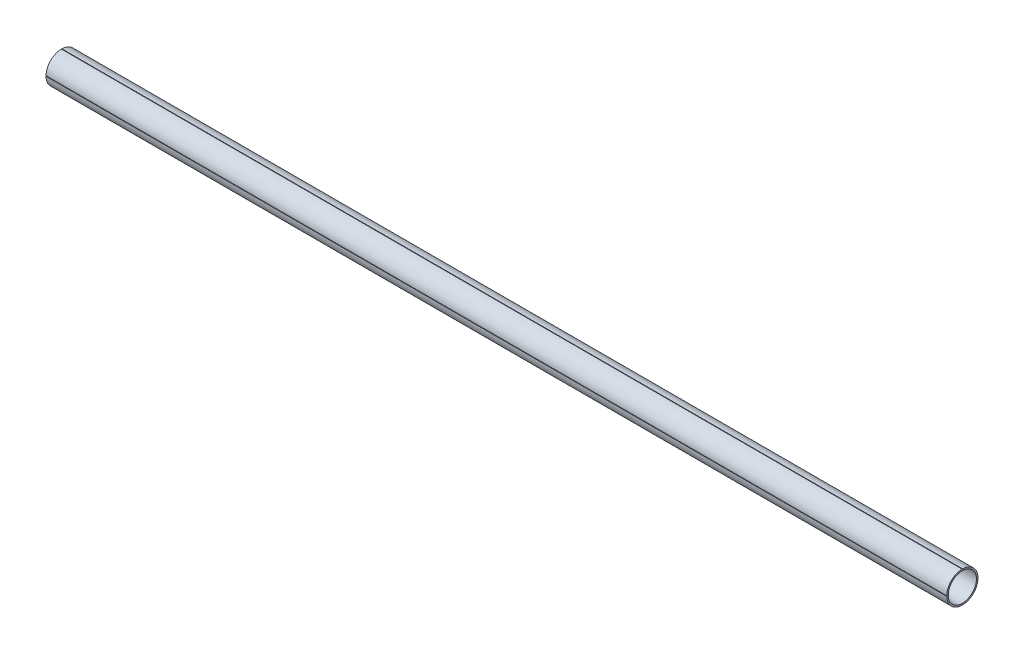
ISO-10303-21;
HEADER;
FILE_DESCRIPTION(('STEP AP214'),'2;1');
FILE_NAME('part.step','',(''),(''),'','','');
FILE_SCHEMA(('AUTOMOTIVE_DESIGN { 1 0 10303 214 1 1 1 1 }'));
ENDSEC;
DATA;
#1=APPLICATION_CONTEXT('core data for automotive mechanical design processes');
#2=APPLICATION_PROTOCOL_DEFINITION('international standard','automotive_design',2000,#1);
#3=PRODUCT_CONTEXT('',#1,'mechanical');
#4=PRODUCT('Part','Part','',(#3));
#5=PRODUCT_RELATED_PRODUCT_CATEGORY('part','',(#4));
#6=PRODUCT_DEFINITION_FORMATION('','',#4);
#7=PRODUCT_DEFINITION_CONTEXT('part definition',#1,'design');
#8=PRODUCT_DEFINITION('design','',#6,#7);
#9=PRODUCT_DEFINITION_SHAPE('','',#8);
#10=(LENGTH_UNIT() NAMED_UNIT(*) SI_UNIT(.MILLI.,.METRE.));
#11=(NAMED_UNIT(*) PLANE_ANGLE_UNIT() SI_UNIT($,.RADIAN.));
#12=(NAMED_UNIT(*) SI_UNIT($,.STERADIAN.) SOLID_ANGLE_UNIT());
#13=UNCERTAINTY_MEASURE_WITH_UNIT(LENGTH_MEASURE(1.E-05),#10,'distance_accuracy_value','');
#14=(GEOMETRIC_REPRESENTATION_CONTEXT(3) GLOBAL_UNCERTAINTY_ASSIGNED_CONTEXT((#13)) GLOBAL_UNIT_ASSIGNED_CONTEXT((#10,
#11,#12)) REPRESENTATION_CONTEXT('',''));
#15=CARTESIAN_POINT('',(0.,0.,0.));
#16=DIRECTION('',(0.,0.,1.));
#17=DIRECTION('',(1.,0.,0.));
#18=AXIS2_PLACEMENT_3D('',#15,#16,#17);
#19=CARTESIAN_POINT('',(-457.2,0.,0.));
#20=DIRECTION('',(1.,0.,0.));
#21=DIRECTION('',(0.,0.,-1.));
#22=AXIS2_PLACEMENT_3D('',#19,#20,#21);
#23=CYLINDRICAL_SURFACE('',#22,15.875);
#24=CARTESIAN_POINT('',(457.2,0.,0.));
#25=DIRECTION('',(1.,0.,0.));
#26=DIRECTION('',(0.,0.,-1.));
#27=AXIS2_PLACEMENT_3D('',#24,#25,#26);
#28=CIRCLE('',#27,15.875);
#29=CARTESIAN_POINT('',(457.2,-0.249999999999835,15.8730313740004));
#30=VERTEX_POINT('',#29);
#31=CARTESIAN_POINT('',(457.2,-15.8730313740004,0.249999999999999));
#32=VERTEX_POINT('',#31);
#33=EDGE_CURVE('E160',#30,#32,#28,.T.);
#34=ORIENTED_EDGE('',*,*,#33,.F.);
#35=DIRECTION('',(1.,0.,0.));
#36=VECTOR('',#35,1.);
#37=CARTESIAN_POINT('',(-457.2,-0.249999999999835,15.8730313740004));
#38=LINE('',#37,#36);
#39=CARTESIAN_POINT('',(-457.2,-0.249999999999835,15.8730313740004));
#40=VERTEX_POINT('',#39);
#41=EDGE_CURVE('E11',#40,#30,#38,.T.);
#42=ORIENTED_EDGE('',*,*,#41,.F.);
#43=CARTESIAN_POINT('',(-457.2,0.,0.));
#44=DIRECTION('',(1.,0.,0.));
#45=DIRECTION('',(0.,0.,-1.));
#46=AXIS2_PLACEMENT_3D('',#43,#44,#45);
#47=CIRCLE('',#46,15.875);
#48=CARTESIAN_POINT('',(-457.2,-15.8730313740004,0.249999999999999));
#49=VERTEX_POINT('',#48);
#50=EDGE_CURVE('E193',#40,#49,#47,.T.);
#51=ORIENTED_EDGE('',*,*,#50,.T.);
#52=DIRECTION('',(1.,0.,0.));
#53=VECTOR('',#52,1.);
#54=CARTESIAN_POINT('',(-457.2,-15.8730313740004,0.249999999999999));
#55=LINE('',#54,#53);
#56=EDGE_CURVE('E40',#49,#32,#55,.T.);
#57=ORIENTED_EDGE('',*,*,#56,.T.);
#58=EDGE_LOOP('',(#34,#42,#51,#57));
#59=FACE_BOUND('',#58,.T.);
#60=ADVANCED_FACE('F37',(#59),#23,.T.);
#61=CARTESIAN_POINT('',(-457.2,1.63166570611758E-13,15.575));
#62=DIRECTION('',(0.,0.766143187719861,0.642669912093643));
#63=DIRECTION('',(0.,-0.642669912093643,0.766143187719861));
#64=AXIS2_PLACEMENT_3D('',#61,#62,#63);
#65=PLANE('',#64);
#66=DIRECTION('',(0.,-0.642669912093643,0.76614318771986));
#67=VECTOR('',#66,1.);
#68=CARTESIAN_POINT('',(457.2,1.63166570611758E-13,15.575));
#69=LINE('',#68,#67);
#70=CARTESIAN_POINT('',(457.2,1.63166570611758E-13,15.575));
#71=VERTEX_POINT('',#70);
#72=EDGE_CURVE('E191',#71,#30,#69,.T.);
#73=ORIENTED_EDGE('',*,*,#72,.F.);
#74=DIRECTION('',(1.,0.,0.));
#75=VECTOR('',#74,1.);
#76=CARTESIAN_POINT('',(-457.2,1.63166570611758E-13,15.575));
#77=LINE('',#76,#75);
#78=CARTESIAN_POINT('',(-457.2,1.63166570611758E-13,15.575));
#79=VERTEX_POINT('',#78);
#80=EDGE_CURVE('E47',#79,#71,#77,.T.);
#81=ORIENTED_EDGE('',*,*,#80,.F.);
#82=DIRECTION('',(0.,-0.642669912093643,0.76614318771986));
#83=VECTOR('',#82,1.);
#84=CARTESIAN_POINT('',(-457.2,1.63166570611758E-13,15.575));
#85=LINE('',#84,#83);
#86=EDGE_CURVE('E150',#79,#40,#85,.T.);
#87=ORIENTED_EDGE('',*,*,#86,.T.);
#88=ORIENTED_EDGE('',*,*,#41,.T.);
#89=EDGE_LOOP('',(#73,#81,#87,#88));
#90=FACE_BOUND('',#89,.T.);
#91=ADVANCED_FACE('F221',(#90),#65,.T.);
#92=CARTESIAN_POINT('',(-457.2,0.250000000000165,15.8730313740004));
#93=DIRECTION('',(0.,-0.766143187719853,0.642669912093652));
#94=DIRECTION('',(0.,-0.642669912093652,-0.766143187719853));
#95=AXIS2_PLACEMENT_3D('',#92,#93,#94);
#96=PLANE('',#95);
#97=DIRECTION('',(0.,-0.642669912093652,-0.766143187719852));
#98=VECTOR('',#97,1.);
#99=CARTESIAN_POINT('',(457.2,0.250000000000165,15.8730313740004));
#100=LINE('',#99,#98);
#101=CARTESIAN_POINT('',(457.2,0.250000000000163,15.8730313740004));
#102=VERTEX_POINT('',#101);
#103=EDGE_CURVE('E136',#102,#71,#100,.T.);
#104=ORIENTED_EDGE('',*,*,#103,.F.);
#105=DIRECTION('',(1.,0.,0.));
#106=VECTOR('',#105,1.);
#107=CARTESIAN_POINT('',(-457.2,0.250000000000163,15.8730313740004));
#108=LINE('',#107,#106);
#109=CARTESIAN_POINT('',(-457.2,0.250000000000163,15.8730313740004));
#110=VERTEX_POINT('',#109);
#111=EDGE_CURVE('E131',#110,#102,#108,.T.);
#112=ORIENTED_EDGE('',*,*,#111,.F.);
#113=DIRECTION('',(0.,-0.642669912093652,-0.766143187719852));
#114=VECTOR('',#113,1.);
#115=CARTESIAN_POINT('',(-457.2,0.250000000000165,15.8730313740004));
#116=LINE('',#115,#114);
#117=EDGE_CURVE('E134',#110,#79,#116,.T.);
#118=ORIENTED_EDGE('',*,*,#117,.T.);
#119=ORIENTED_EDGE('',*,*,#80,.T.);
#120=EDGE_LOOP('',(#104,#112,#118,#119));
#121=FACE_BOUND('',#120,.T.);
#122=ADVANCED_FACE('F133',(#121),#96,.T.);
#123=CARTESIAN_POINT('',(-457.2,0.,0.));
#124=DIRECTION('',(1.,0.,0.));
#125=DIRECTION('',(0.,0.,-1.));
#126=AXIS2_PLACEMENT_3D('',#123,#124,#125);
#127=CYLINDRICAL_SURFACE('',#126,15.875);
#128=CARTESIAN_POINT('',(457.2,0.,0.));
#129=DIRECTION('',(1.,0.,0.));
#130=DIRECTION('',(0.,0.,-1.));
#131=AXIS2_PLACEMENT_3D('',#128,#129,#130);
#132=CIRCLE('',#131,15.875);
#133=CARTESIAN_POINT('',(457.2,15.8730313740004,0.250000000000002));
#134=VERTEX_POINT('',#133);
#135=EDGE_CURVE('E188',#134,#102,#132,.T.);
#136=ORIENTED_EDGE('',*,*,#135,.F.);
#137=DIRECTION('',(1.,0.,0.));
#138=VECTOR('',#137,1.);
#139=CARTESIAN_POINT('',(-457.2,15.8730313740004,0.250000000000002));
#140=LINE('',#139,#138);
#141=CARTESIAN_POINT('',(-457.2,15.8730313740004,0.250000000000002));
#142=VERTEX_POINT('',#141);
#143=EDGE_CURVE('E142',#142,#134,#140,.T.);
#144=ORIENTED_EDGE('',*,*,#143,.F.);
#145=CARTESIAN_POINT('',(-457.2,0.,0.));
#146=DIRECTION('',(1.,0.,0.));
#147=DIRECTION('',(0.,0.,-1.));
#148=AXIS2_PLACEMENT_3D('',#145,#146,#147);
#149=CIRCLE('',#148,15.875);
#150=EDGE_CURVE('E148',#142,#110,#149,.T.);
#151=ORIENTED_EDGE('',*,*,#150,.T.);
#152=ORIENTED_EDGE('',*,*,#111,.T.);
#153=EDGE_LOOP('',(#136,#144,#151,#152));
#154=FACE_BOUND('',#153,.T.);
#155=ADVANCED_FACE('F152',(#154),#127,.T.);
#156=CARTESIAN_POINT('',(-457.2,15.575,0.));
#157=DIRECTION('',(0.,0.642669912093652,-0.766143187719853));
#158=DIRECTION('',(0.,0.766143187719853,0.642669912093652));
#159=AXIS2_PLACEMENT_3D('',#156,#157,#158);
#160=PLANE('',#159);
#161=DIRECTION('',(0.,0.766143187719853,0.642669912093652));
#162=VECTOR('',#161,1.);
#163=CARTESIAN_POINT('',(457.2,15.575,0.));
#164=LINE('',#163,#162);
#165=CARTESIAN_POINT('',(457.2,15.575,0.));
#166=VERTEX_POINT('',#165);
#167=EDGE_CURVE('E185',#166,#134,#164,.T.);
#168=ORIENTED_EDGE('',*,*,#167,.F.);
#169=DIRECTION('',(1.,0.,0.));
#170=VECTOR('',#169,1.);
#171=CARTESIAN_POINT('',(-457.2,15.575,0.));
#172=LINE('',#171,#170);
#173=CARTESIAN_POINT('',(-457.2,15.575,0.));
#174=VERTEX_POINT('',#173);
#175=EDGE_CURVE('E199',#174,#166,#172,.T.);
#176=ORIENTED_EDGE('',*,*,#175,.F.);
#177=DIRECTION('',(0.,0.766143187719853,0.642669912093652));
#178=VECTOR('',#177,1.);
#179=CARTESIAN_POINT('',(-457.2,15.575,0.));
#180=LINE('',#179,#178);
#181=EDGE_CURVE('E153',#174,#142,#180,.T.);
#182=ORIENTED_EDGE('',*,*,#181,.T.);
#183=ORIENTED_EDGE('',*,*,#143,.T.);
#184=EDGE_LOOP('',(#168,#176,#182,#183));
#185=FACE_BOUND('',#184,.T.);
#186=ADVANCED_FACE('F234',(#185),#160,.T.);
#187=CARTESIAN_POINT('',(-457.2,15.8730313740004,-0.249999999999999));
#188=DIRECTION('',(0.,0.642669912093643,0.76614318771986));
#189=DIRECTION('',(0.,-0.76614318771986,0.642669912093643));
#190=AXIS2_PLACEMENT_3D('',#187,#188,#189);
#191=PLANE('',#190);
#192=DIRECTION('',(0.,-0.76614318771986,0.642669912093643));
#193=VECTOR('',#192,1.);
#194=CARTESIAN_POINT('',(457.2,15.8730313740004,-0.249999999999999));
#195=LINE('',#194,#193);
#196=CARTESIAN_POINT('',(457.2,15.8730313740004,-0.25));
#197=VERTEX_POINT('',#196);
#198=EDGE_CURVE('E182',#197,#166,#195,.T.);
#199=ORIENTED_EDGE('',*,*,#198,.F.);
#200=DIRECTION('',(1.,0.,0.));
#201=VECTOR('',#200,1.);
#202=CARTESIAN_POINT('',(-457.2,15.8730313740004,-0.25));
#203=LINE('',#202,#201);
#204=CARTESIAN_POINT('',(-457.2,15.8730313740004,-0.25));
#205=VERTEX_POINT('',#204);
#206=EDGE_CURVE('E202',#205,#197,#203,.T.);
#207=ORIENTED_EDGE('',*,*,#206,.F.);
#208=DIRECTION('',(0.,-0.76614318771986,0.642669912093643));
#209=VECTOR('',#208,1.);
#210=CARTESIAN_POINT('',(-457.2,15.8730313740004,-0.249999999999999));
#211=LINE('',#210,#209);
#212=EDGE_CURVE('E155',#205,#174,#211,.T.);
#213=ORIENTED_EDGE('',*,*,#212,.T.);
#214=ORIENTED_EDGE('',*,*,#175,.T.);
#215=EDGE_LOOP('',(#199,#207,#213,#214));
#216=FACE_BOUND('',#215,.T.);
#217=ADVANCED_FACE('F237',(#216),#191,.T.);
#218=CARTESIAN_POINT('',(-457.2,0.,0.));
#219=DIRECTION('',(1.,0.,0.));
#220=DIRECTION('',(0.,0.,-1.));
#221=AXIS2_PLACEMENT_3D('',#218,#219,#220);
#222=CYLINDRICAL_SURFACE('',#221,15.875);
#223=CARTESIAN_POINT('',(457.2,0.,0.));
#224=DIRECTION('',(1.,0.,0.));
#225=DIRECTION('',(0.,0.,-1.));
#226=AXIS2_PLACEMENT_3D('',#223,#224,#225);
#227=CIRCLE('',#226,15.875);
#228=CARTESIAN_POINT('',(457.2,0.249999999999946,-15.8730313740004));
#229=VERTEX_POINT('',#228);
#230=EDGE_CURVE('E179',#229,#197,#227,.T.);
#231=ORIENTED_EDGE('',*,*,#230,.F.);
#232=DIRECTION('',(1.,0.,0.));
#233=VECTOR('',#232,1.);
#234=CARTESIAN_POINT('',(-457.2,0.249999999999946,-15.8730313740004));
#235=LINE('',#234,#233);
#236=CARTESIAN_POINT('',(-457.2,0.249999999999946,-15.8730313740004));
#237=VERTEX_POINT('',#236);
#238=EDGE_CURVE('E205',#237,#229,#235,.T.);
#239=ORIENTED_EDGE('',*,*,#238,.F.);
#240=CARTESIAN_POINT('',(-457.2,0.,0.));
#241=DIRECTION('',(1.,0.,0.));
#242=DIRECTION('',(0.,0.,-1.));
#243=AXIS2_PLACEMENT_3D('',#240,#241,#242);
#244=CIRCLE('',#243,15.875);
#245=EDGE_CURVE('E300',#237,#205,#244,.T.);
#246=ORIENTED_EDGE('',*,*,#245,.T.);
#247=ORIENTED_EDGE('',*,*,#206,.T.);
#248=EDGE_LOOP('',(#231,#239,#246,#247));
#249=FACE_BOUND('',#248,.T.);
#250=ADVANCED_FACE('F241',(#249),#222,.T.);
#251=CARTESIAN_POINT('',(-457.2,0.,-15.575));
#252=DIRECTION('',(0.,-0.766143187719854,-0.642669912093651));
#253=DIRECTION('',(0.,0.642669912093651,-0.766143187719854));
#254=AXIS2_PLACEMENT_3D('',#251,#252,#253);
#255=PLANE('',#254);
#256=DIRECTION('',(0.,0.642669912093651,-0.766143187719854));
#257=VECTOR('',#256,1.);
#258=CARTESIAN_POINT('',(457.2,0.,-15.575));
#259=LINE('',#258,#257);
#260=CARTESIAN_POINT('',(457.2,0.,-15.575));
#261=VERTEX_POINT('',#260);
#262=EDGE_CURVE('E176',#261,#229,#259,.T.);
#263=ORIENTED_EDGE('',*,*,#262,.F.);
#264=DIRECTION('',(1.,0.,0.));
#265=VECTOR('',#264,1.);
#266=CARTESIAN_POINT('',(-457.2,0.,-15.575));
#267=LINE('',#266,#265);
#268=CARTESIAN_POINT('',(-457.2,0.,-15.575));
#269=VERTEX_POINT('',#268);
#270=EDGE_CURVE('E208',#269,#261,#267,.T.);
#271=ORIENTED_EDGE('',*,*,#270,.F.);
#272=DIRECTION('',(0.,0.642669912093651,-0.766143187719854));
#273=VECTOR('',#272,1.);
#274=CARTESIAN_POINT('',(-457.2,0.,-15.575));
#275=LINE('',#274,#273);
#276=EDGE_CURVE('E297',#269,#237,#275,.T.);
#277=ORIENTED_EDGE('',*,*,#276,.T.);
#278=ORIENTED_EDGE('',*,*,#238,.T.);
#279=EDGE_LOOP('',(#263,#271,#277,#278));
#280=FACE_BOUND('',#279,.T.);
#281=ADVANCED_FACE('F245',(#280),#255,.T.);
#282=CARTESIAN_POINT('',(-457.2,-0.250000000000054,-15.8730313740004));
#283=DIRECTION('',(0.,0.766143187719859,-0.642669912093645));
#284=DIRECTION('',(0.,0.642669912093645,0.766143187719859));
#285=AXIS2_PLACEMENT_3D('',#282,#283,#284);
#286=PLANE('',#285);
#287=DIRECTION('',(0.,0.642669912093645,0.766143187719859));
#288=VECTOR('',#287,1.);
#289=CARTESIAN_POINT('',(457.2,-0.250000000000054,-15.8730313740004));
#290=LINE('',#289,#288);
#291=CARTESIAN_POINT('',(457.2,-0.250000000000059,-15.8730313740004));
#292=VERTEX_POINT('',#291);
#293=EDGE_CURVE('E173',#292,#261,#290,.T.);
#294=ORIENTED_EDGE('',*,*,#293,.F.);
#295=DIRECTION('',(1.,0.,0.));
#296=VECTOR('',#295,1.);
#297=CARTESIAN_POINT('',(-457.2,-0.250000000000059,-15.8730313740004));
#298=LINE('',#297,#296);
#299=CARTESIAN_POINT('',(-457.2,-0.250000000000059,-15.8730313740004));
#300=VERTEX_POINT('',#299);
#301=EDGE_CURVE('E210',#300,#292,#298,.T.);
#302=ORIENTED_EDGE('',*,*,#301,.F.);
#303=DIRECTION('',(0.,0.642669912093645,0.766143187719859));
#304=VECTOR('',#303,1.);
#305=CARTESIAN_POINT('',(-457.2,-0.250000000000054,-15.8730313740004));
#306=LINE('',#305,#304);
#307=EDGE_CURVE('E294',#300,#269,#306,.T.);
#308=ORIENTED_EDGE('',*,*,#307,.T.);
#309=ORIENTED_EDGE('',*,*,#270,.T.);
#310=EDGE_LOOP('',(#294,#302,#308,#309));
#311=FACE_BOUND('',#310,.T.);
#312=ADVANCED_FACE('F249',(#311),#286,.T.);
#313=CARTESIAN_POINT('',(-457.2,0.,0.));
#314=DIRECTION('',(1.,0.,0.));
#315=DIRECTION('',(0.,0.,-1.));
#316=AXIS2_PLACEMENT_3D('',#313,#314,#315);
#317=CYLINDRICAL_SURFACE('',#316,15.875);
#318=CARTESIAN_POINT('',(457.2,0.,0.));
#319=DIRECTION('',(1.,0.,0.));
#320=DIRECTION('',(0.,0.,-1.));
#321=AXIS2_PLACEMENT_3D('',#318,#319,#320);
#322=CIRCLE('',#321,15.875);
#323=CARTESIAN_POINT('',(457.2,-15.8730313740004,-0.250000000000002));
#324=VERTEX_POINT('',#323);
#325=EDGE_CURVE('E170',#324,#292,#322,.T.);
#326=ORIENTED_EDGE('',*,*,#325,.F.);
#327=DIRECTION('',(1.,0.,0.));
#328=VECTOR('',#327,1.);
#329=CARTESIAN_POINT('',(-457.2,-15.8730313740004,-0.250000000000002));
#330=LINE('',#329,#328);
#331=CARTESIAN_POINT('',(-457.2,-15.8730313740004,-0.250000000000002));
#332=VERTEX_POINT('',#331);
#333=EDGE_CURVE('E212',#332,#324,#330,.T.);
#334=ORIENTED_EDGE('',*,*,#333,.F.);
#335=CARTESIAN_POINT('',(-457.2,0.,0.));
#336=DIRECTION('',(1.,0.,0.));
#337=DIRECTION('',(0.,0.,-1.));
#338=AXIS2_PLACEMENT_3D('',#335,#336,#337);
#339=CIRCLE('',#338,15.875);
#340=EDGE_CURVE('E291',#332,#300,#339,.T.);
#341=ORIENTED_EDGE('',*,*,#340,.T.);
#342=ORIENTED_EDGE('',*,*,#301,.T.);
#343=EDGE_LOOP('',(#326,#334,#341,#342));
#344=FACE_BOUND('',#343,.T.);
#345=ADVANCED_FACE('F253',(#344),#317,.T.);
#346=CARTESIAN_POINT('',(-457.2,-15.575,0.));
#347=DIRECTION('',(0.,-0.642669912093652,0.766143187719853));
#348=DIRECTION('',(0.,-0.766143187719853,-0.642669912093652));
#349=AXIS2_PLACEMENT_3D('',#346,#347,#348);
#350=PLANE('',#349);
#351=DIRECTION('',(0.,-0.766143187719853,-0.642669912093652));
#352=VECTOR('',#351,1.);
#353=CARTESIAN_POINT('',(457.2,-15.575,0.));
#354=LINE('',#353,#352);
#355=CARTESIAN_POINT('',(457.2,-15.575,0.));
#356=VERTEX_POINT('',#355);
#357=EDGE_CURVE('E167',#356,#324,#354,.T.);
#358=ORIENTED_EDGE('',*,*,#357,.F.);
#359=DIRECTION('',(1.,0.,0.));
#360=VECTOR('',#359,1.);
#361=CARTESIAN_POINT('',(-457.2,-15.575,0.));
#362=LINE('',#361,#360);
#363=CARTESIAN_POINT('',(-457.2,-15.575,0.));
#364=VERTEX_POINT('',#363);
#365=EDGE_CURVE('E213',#364,#356,#362,.T.);
#366=ORIENTED_EDGE('',*,*,#365,.F.);
#367=DIRECTION('',(0.,-0.766143187719853,-0.642669912093652));
#368=VECTOR('',#367,1.);
#369=CARTESIAN_POINT('',(-457.2,-15.575,0.));
#370=LINE('',#369,#368);
#371=EDGE_CURVE('E288',#364,#332,#370,.T.);
#372=ORIENTED_EDGE('',*,*,#371,.T.);
#373=ORIENTED_EDGE('',*,*,#333,.T.);
#374=EDGE_LOOP('',(#358,#366,#372,#373));
#375=FACE_BOUND('',#374,.T.);
#376=ADVANCED_FACE('F257',(#375),#350,.T.);
#377=CARTESIAN_POINT('',(-457.2,-15.8730313740004,0.249999999999999));
#378=DIRECTION('',(0.,-0.642669912093643,-0.76614318771986));
#379=DIRECTION('',(0.,0.76614318771986,-0.642669912093643));
#380=AXIS2_PLACEMENT_3D('',#377,#378,#379);
#381=PLANE('',#380);
#382=DIRECTION('',(0.,0.76614318771986,-0.642669912093643));
#383=VECTOR('',#382,1.);
#384=CARTESIAN_POINT('',(457.2,-15.8730313740004,0.249999999999999));
#385=LINE('',#384,#383);
#386=EDGE_CURVE('E163',#32,#356,#385,.T.);
#387=ORIENTED_EDGE('',*,*,#386,.F.);
#388=ORIENTED_EDGE('',*,*,#56,.F.);
#389=DIRECTION('',(0.,0.76614318771986,-0.642669912093643));
#390=VECTOR('',#389,1.);
#391=CARTESIAN_POINT('',(-457.2,-15.8730313740004,0.249999999999999));
#392=LINE('',#391,#390);
#393=EDGE_CURVE('E286',#49,#364,#392,.T.);
#394=ORIENTED_EDGE('',*,*,#393,.T.);
#395=ORIENTED_EDGE('',*,*,#365,.T.);
#396=EDGE_LOOP('',(#387,#388,#394,#395));
#397=FACE_BOUND('',#396,.T.);
#398=ADVANCED_FACE('F218',(#397),#381,.T.);
#399=CARTESIAN_POINT('',(-457.2,0.,0.));
#400=DIRECTION('',(1.,0.,0.));
#401=DIRECTION('',(0.,0.,-1.));
#402=AXIS2_PLACEMENT_3D('',#399,#400,#401);
#403=PLANE('',#402);
#404=CARTESIAN_POINT('',(-457.2,0.,0.));
#405=DIRECTION('',(1.,0.,0.));
#406=DIRECTION('',(0.,0.,1.));
#407=AXIS2_PLACEMENT_3D('',#404,#405,#406);
#408=CIRCLE('',#407,14.3);
#409=CARTESIAN_POINT('',(-457.2,0.,14.3));
#410=VERTEX_POINT('',#409);
#411=EDGE_CURVE('E164',#410,#410,#408,.T.);
#412=ORIENTED_EDGE('',*,*,#411,.T.);
#413=EDGE_LOOP('',(#412));
#414=FACE_BOUND('',#413,.T.);
#415=ORIENTED_EDGE('',*,*,#50,.F.);
#416=ORIENTED_EDGE('',*,*,#86,.F.);
#417=ORIENTED_EDGE('',*,*,#117,.F.);
#418=ORIENTED_EDGE('',*,*,#150,.F.);
#419=ORIENTED_EDGE('',*,*,#181,.F.);
#420=ORIENTED_EDGE('',*,*,#212,.F.);
#421=ORIENTED_EDGE('',*,*,#245,.F.);
#422=ORIENTED_EDGE('',*,*,#276,.F.);
#423=ORIENTED_EDGE('',*,*,#307,.F.);
#424=ORIENTED_EDGE('',*,*,#340,.F.);
#425=ORIENTED_EDGE('',*,*,#371,.F.);
#426=ORIENTED_EDGE('',*,*,#393,.F.);
#427=EDGE_LOOP('',(#415,#416,#417,#418,#419,#420,#421,#422,#423,#424,#425,#426));
#428=FACE_BOUND('',#427,.T.);
#429=ADVANCED_FACE('F146',(#414,#428),#403,.F.);
#430=CARTESIAN_POINT('',(457.2,0.,0.));
#431=DIRECTION('',(1.,0.,0.));
#432=DIRECTION('',(0.,0.,-1.));
#433=AXIS2_PLACEMENT_3D('',#430,#431,#432);
#434=PLANE('',#433);
#435=CARTESIAN_POINT('',(457.2,0.,0.));
#436=DIRECTION('',(1.,0.,0.));
#437=DIRECTION('',(0.,0.,1.));
#438=AXIS2_PLACEMENT_3D('',#435,#436,#437);
#439=CIRCLE('',#438,14.3);
#440=CARTESIAN_POINT('',(457.2,0.,14.3));
#441=VERTEX_POINT('',#440);
#442=EDGE_CURVE('E281',#441,#441,#439,.T.);
#443=ORIENTED_EDGE('',*,*,#442,.F.);
#444=EDGE_LOOP('',(#443));
#445=FACE_BOUND('',#444,.T.);
#446=ORIENTED_EDGE('',*,*,#33,.T.);
#447=ORIENTED_EDGE('',*,*,#386,.T.);
#448=ORIENTED_EDGE('',*,*,#357,.T.);
#449=ORIENTED_EDGE('',*,*,#325,.T.);
#450=ORIENTED_EDGE('',*,*,#293,.T.);
#451=ORIENTED_EDGE('',*,*,#262,.T.);
#452=ORIENTED_EDGE('',*,*,#230,.T.);
#453=ORIENTED_EDGE('',*,*,#198,.T.);
#454=ORIENTED_EDGE('',*,*,#167,.T.);
#455=ORIENTED_EDGE('',*,*,#135,.T.);
#456=ORIENTED_EDGE('',*,*,#103,.T.);
#457=ORIENTED_EDGE('',*,*,#72,.T.);
#458=EDGE_LOOP('',(#446,#447,#448,#449,#450,#451,#452,#453,#454,#455,#456,#457));
#459=FACE_BOUND('',#458,.T.);
#460=ADVANCED_FACE('F220',(#445,#459),#434,.T.);
#461=CARTESIAN_POINT('',(-457.2,0.,0.));
#462=DIRECTION('',(1.,0.,0.));
#463=DIRECTION('',(0.,0.,-1.));
#464=AXIS2_PLACEMENT_3D('',#461,#462,#463);
#465=CYLINDRICAL_SURFACE('',#464,14.3);
#466=ORIENTED_EDGE('',*,*,#411,.F.);
#467=EDGE_LOOP('',(#466));
#468=FACE_BOUND('',#467,.T.);
#469=ORIENTED_EDGE('',*,*,#442,.T.);
#470=EDGE_LOOP('',(#469));
#471=FACE_BOUND('',#470,.T.);
#472=ADVANCED_FACE('F269',(#468,#471),#465,.F.);
#473=CLOSED_SHELL('',(#60,#91,#122,#155,#186,#217,#250,#281,#312,#345,#376,#398,#429,#460,#472));
#474=MANIFOLD_SOLID_BREP('B2',#473);
#475=ADVANCED_BREP_SHAPE_REPRESENTATION('',(#18,#474),#14);
#476=SHAPE_DEFINITION_REPRESENTATION(#9,#475);
ENDSEC;
END-ISO-10303-21;
